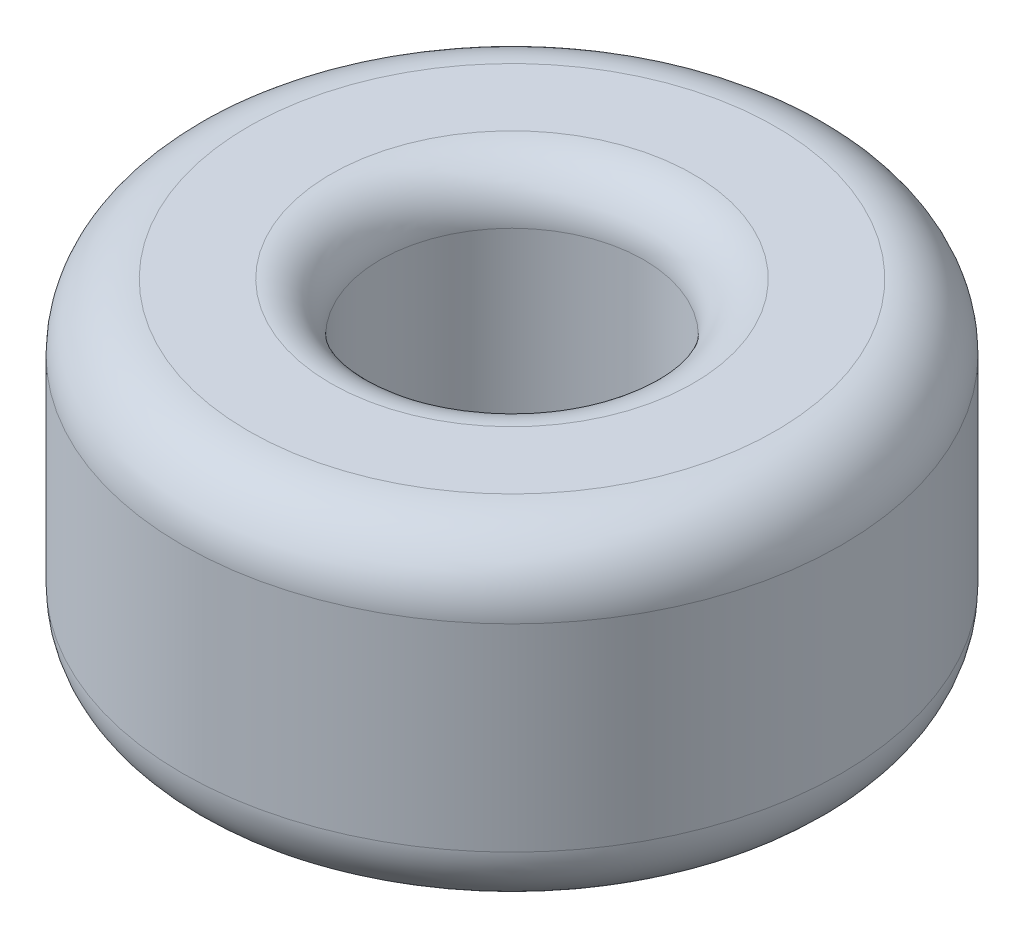
ISO-10303-21;
HEADER;
FILE_DESCRIPTION(('STEP AP214'),'2;1');
FILE_NAME('part.step','',(''),(''),'','','');
FILE_SCHEMA(('AUTOMOTIVE_DESIGN { 1 0 10303 214 1 1 1 1 }'));
ENDSEC;
DATA;
#1=APPLICATION_CONTEXT('core data for automotive mechanical design processes');
#2=APPLICATION_PROTOCOL_DEFINITION('international standard','automotive_design',2000,#1);
#3=PRODUCT_CONTEXT('',#1,'mechanical');
#4=PRODUCT('Part','Part','',(#3));
#5=PRODUCT_RELATED_PRODUCT_CATEGORY('part','',(#4));
#6=PRODUCT_DEFINITION_FORMATION('','',#4);
#7=PRODUCT_DEFINITION_CONTEXT('part definition',#1,'design');
#8=PRODUCT_DEFINITION('design','',#6,#7);
#9=PRODUCT_DEFINITION_SHAPE('','',#8);
#10=(LENGTH_UNIT() NAMED_UNIT(*) SI_UNIT(.MILLI.,.METRE.));
#11=(NAMED_UNIT(*) PLANE_ANGLE_UNIT() SI_UNIT($,.RADIAN.));
#12=(NAMED_UNIT(*) SI_UNIT($,.STERADIAN.) SOLID_ANGLE_UNIT());
#13=UNCERTAINTY_MEASURE_WITH_UNIT(LENGTH_MEASURE(1.E-05),#10,'distance_accuracy_value','');
#14=(GEOMETRIC_REPRESENTATION_CONTEXT(3) GLOBAL_UNCERTAINTY_ASSIGNED_CONTEXT((#13)) GLOBAL_UNIT_ASSIGNED_CONTEXT((#10,
#11,#12)) REPRESENTATION_CONTEXT('',''));
#15=CARTESIAN_POINT('',(0.,0.,0.));
#16=DIRECTION('',(0.,0.,1.));
#17=DIRECTION('',(1.,0.,0.));
#18=AXIS2_PLACEMENT_3D('',#15,#16,#17);
#19=CARTESIAN_POINT('',(0.,50.,0.));
#20=DIRECTION('',(0.,1.,0.));
#21=DIRECTION('',(0.,0.,1.));
#22=AXIS2_PLACEMENT_3D('',#19,#20,#21);
#23=PLANE('',#22);
#24=CARTESIAN_POINT('',(0.,50.,0.));
#25=DIRECTION('',(0.,1.,0.));
#26=DIRECTION('',(0.,0.,1.));
#27=AXIS2_PLACEMENT_3D('',#24,#25,#26);
#28=CIRCLE('',#27,27.5);
#29=CARTESIAN_POINT('',(0.,50.,27.5));
#30=VERTEX_POINT('',#29);
#31=EDGE_CURVE('E39',#30,#30,#28,.F.);
#32=ORIENTED_EDGE('',*,*,#31,.T.);
#33=EDGE_LOOP('',(#32));
#34=FACE_BOUND('',#33,.T.);
#35=CARTESIAN_POINT('',(0.,50.,0.));
#36=DIRECTION('',(0.,1.,0.));
#37=DIRECTION('',(0.,0.,1.));
#38=AXIS2_PLACEMENT_3D('',#35,#36,#37);
#39=CIRCLE('',#38,40.);
#40=CARTESIAN_POINT('',(0.,50.,40.));
#41=VERTEX_POINT('',#40);
#42=EDGE_CURVE('E52',#41,#41,#39,.T.);
#43=ORIENTED_EDGE('',*,*,#42,.T.);
#44=EDGE_LOOP('',(#43));
#45=FACE_BOUND('',#44,.T.);
#46=ADVANCED_FACE('F32',(#34,#45),#23,.T.);
#47=CARTESIAN_POINT('',(0.,0.,0.));
#48=DIRECTION('',(0.,1.,0.));
#49=DIRECTION('',(0.,0.,1.));
#50=AXIS2_PLACEMENT_3D('',#47,#48,#49);
#51=PLANE('',#50);
#52=CARTESIAN_POINT('',(0.,0.,0.));
#53=DIRECTION('',(0.,1.,0.));
#54=DIRECTION('',(0.,0.,1.));
#55=AXIS2_PLACEMENT_3D('',#52,#53,#54);
#56=CIRCLE('',#55,27.5);
#57=CARTESIAN_POINT('',(0.,0.,27.5));
#58=VERTEX_POINT('',#57);
#59=EDGE_CURVE('E10',#58,#58,#56,.T.);
#60=ORIENTED_EDGE('',*,*,#59,.T.);
#61=EDGE_LOOP('',(#60));
#62=FACE_BOUND('',#61,.T.);
#63=CARTESIAN_POINT('',(0.,0.,0.));
#64=DIRECTION('',(0.,1.,0.));
#65=DIRECTION('',(0.,0.,1.));
#66=AXIS2_PLACEMENT_3D('',#63,#64,#65);
#67=CIRCLE('',#66,40.);
#68=CARTESIAN_POINT('',(0.,0.,40.));
#69=VERTEX_POINT('',#68);
#70=EDGE_CURVE('E55',#69,#69,#67,.F.);
#71=ORIENTED_EDGE('',*,*,#70,.T.);
#72=EDGE_LOOP('',(#71));
#73=FACE_BOUND('',#72,.T.);
#74=ADVANCED_FACE('F76',(#62,#73),#51,.F.);
#75=CARTESIAN_POINT('',(0.,50.,0.));
#76=DIRECTION('',(0.,-1.,0.));
#77=DIRECTION('',(0.,0.,-1.));
#78=AXIS2_PLACEMENT_3D('',#75,#76,#77);
#79=CYLINDRICAL_SURFACE('',#78,50.);
#80=CARTESIAN_POINT('',(0.,10.,0.));
#81=DIRECTION('',(0.,1.,0.));
#82=DIRECTION('',(0.,0.,1.));
#83=AXIS2_PLACEMENT_3D('',#80,#81,#82);
#84=CIRCLE('',#83,50.);
#85=CARTESIAN_POINT('',(0.,10.,50.));
#86=VERTEX_POINT('',#85);
#87=EDGE_CURVE('E58',#86,#86,#84,.T.);
#88=ORIENTED_EDGE('',*,*,#87,.T.);
#89=EDGE_LOOP('',(#88));
#90=FACE_BOUND('',#89,.T.);
#91=CARTESIAN_POINT('',(0.,40.,0.));
#92=DIRECTION('',(0.,1.,0.));
#93=DIRECTION('',(0.,0.,1.));
#94=AXIS2_PLACEMENT_3D('',#91,#92,#93);
#95=CIRCLE('',#94,50.);
#96=CARTESIAN_POINT('',(0.,40.,50.));
#97=VERTEX_POINT('',#96);
#98=EDGE_CURVE('E61',#97,#97,#95,.F.);
#99=ORIENTED_EDGE('',*,*,#98,.T.);
#100=EDGE_LOOP('',(#99));
#101=FACE_BOUND('',#100,.T.);
#102=ADVANCED_FACE('F65',(#90,#101),#79,.T.);
#103=CARTESIAN_POINT('',(0.,50.,0.));
#104=DIRECTION('',(0.,-1.,0.));
#105=DIRECTION('',(0.,0.,-1.));
#106=AXIS2_PLACEMENT_3D('',#103,#104,#105);
#107=CYLINDRICAL_SURFACE('',#106,20.);
#108=CARTESIAN_POINT('',(0.,42.5,0.));
#109=DIRECTION('',(0.,1.,0.));
#110=DIRECTION('',(0.,0.,1.));
#111=AXIS2_PLACEMENT_3D('',#108,#109,#110);
#112=CIRCLE('',#111,20.);
#113=CARTESIAN_POINT('',(0.,42.5,20.));
#114=VERTEX_POINT('',#113);
#115=EDGE_CURVE('E43',#114,#114,#112,.T.);
#116=ORIENTED_EDGE('',*,*,#115,.T.);
#117=EDGE_LOOP('',(#116));
#118=FACE_BOUND('',#117,.T.);
#119=CARTESIAN_POINT('',(0.,7.5,0.));
#120=DIRECTION('',(0.,1.,0.));
#121=DIRECTION('',(0.,0.,1.));
#122=AXIS2_PLACEMENT_3D('',#119,#120,#121);
#123=CIRCLE('',#122,20.);
#124=CARTESIAN_POINT('',(0.,7.5,20.));
#125=VERTEX_POINT('',#124);
#126=EDGE_CURVE('E47',#125,#125,#123,.F.);
#127=ORIENTED_EDGE('',*,*,#126,.T.);
#128=EDGE_LOOP('',(#127));
#129=FACE_BOUND('',#128,.T.);
#130=ADVANCED_FACE('F83',(#118,#129),#107,.F.);
#131=CARTESIAN_POINT('',(0.,10.,0.));
#132=DIRECTION('',(0.,1.,0.));
#133=DIRECTION('',(0.,0.,1.));
#134=AXIS2_PLACEMENT_3D('',#131,#132,#133);
#135=TOROIDAL_SURFACE('',#134,40.,10.);
#136=ORIENTED_EDGE('',*,*,#70,.F.);
#137=EDGE_LOOP('',(#136));
#138=FACE_BOUND('',#137,.T.);
#139=ORIENTED_EDGE('',*,*,#87,.F.);
#140=EDGE_LOOP('',(#139));
#141=FACE_BOUND('',#140,.T.);
#142=ADVANCED_FACE('F71',(#138,#141),#135,.T.);
#143=CARTESIAN_POINT('',(0.,40.,0.));
#144=DIRECTION('',(0.,1.,0.));
#145=DIRECTION('',(0.,0.,1.));
#146=AXIS2_PLACEMENT_3D('',#143,#144,#145);
#147=TOROIDAL_SURFACE('',#146,40.,10.);
#148=ORIENTED_EDGE('',*,*,#98,.F.);
#149=EDGE_LOOP('',(#148));
#150=FACE_BOUND('',#149,.T.);
#151=ORIENTED_EDGE('',*,*,#42,.F.);
#152=EDGE_LOOP('',(#151));
#153=FACE_BOUND('',#152,.T.);
#154=ADVANCED_FACE('F67',(#150,#153),#147,.T.);
#155=CARTESIAN_POINT('',(0.,42.5,0.));
#156=DIRECTION('',(0.,1.,0.));
#157=DIRECTION('',(0.,0.,1.));
#158=AXIS2_PLACEMENT_3D('',#155,#156,#157);
#159=TOROIDAL_SURFACE('',#158,27.5,7.5);
#160=ORIENTED_EDGE('',*,*,#31,.F.);
#161=EDGE_LOOP('',(#160));
#162=FACE_BOUND('',#161,.T.);
#163=ORIENTED_EDGE('',*,*,#115,.F.);
#164=EDGE_LOOP('',(#163));
#165=FACE_BOUND('',#164,.T.);
#166=ADVANCED_FACE('F70',(#162,#165),#159,.T.);
#167=CARTESIAN_POINT('',(0.,7.5,0.));
#168=DIRECTION('',(0.,1.,0.));
#169=DIRECTION('',(0.,0.,1.));
#170=AXIS2_PLACEMENT_3D('',#167,#168,#169);
#171=TOROIDAL_SURFACE('',#170,27.5,7.5);
#172=ORIENTED_EDGE('',*,*,#126,.F.);
#173=EDGE_LOOP('',(#172));
#174=FACE_BOUND('',#173,.T.);
#175=ORIENTED_EDGE('',*,*,#59,.F.);
#176=EDGE_LOOP('',(#175));
#177=FACE_BOUND('',#176,.T.);
#178=ADVANCED_FACE('F34',(#174,#177),#171,.T.);
#179=CLOSED_SHELL('',(#46,#74,#102,#130,#142,#154,#166,#178));
#180=MANIFOLD_SOLID_BREP('B2',#179);
#181=ADVANCED_BREP_SHAPE_REPRESENTATION('',(#18,#180),#14);
#182=SHAPE_DEFINITION_REPRESENTATION(#9,#181);
ENDSEC;
END-ISO-10303-21;
